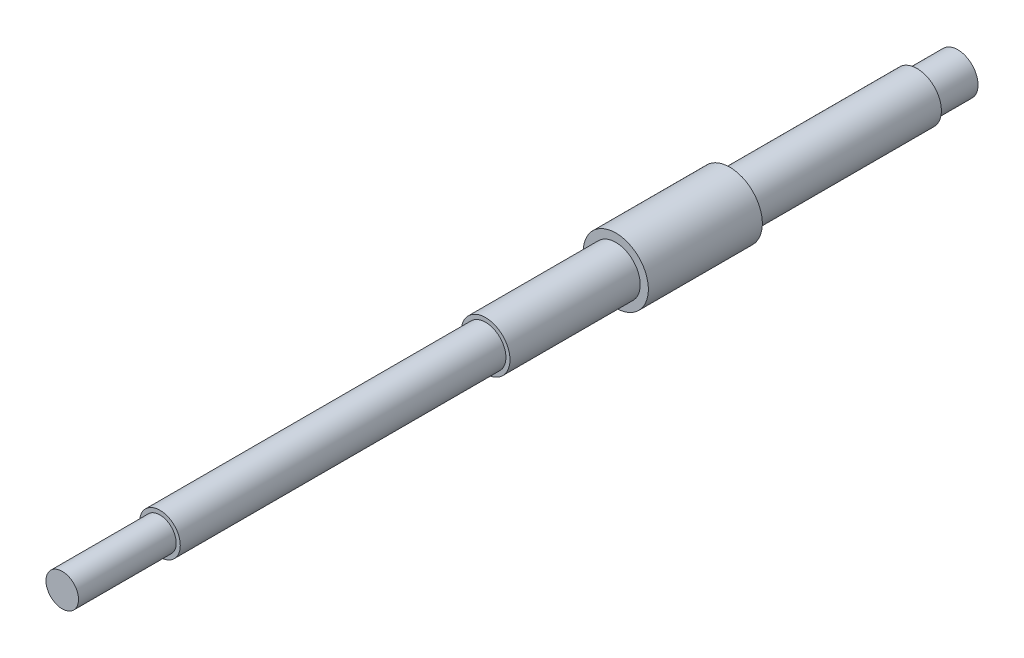
ISO-10303-21;
HEADER;
FILE_DESCRIPTION(('STEP AP214'),'2;1');
FILE_NAME('part.step','',(''),(''),'','','');
FILE_SCHEMA(('AUTOMOTIVE_DESIGN { 1 0 10303 214 1 1 1 1 }'));
ENDSEC;
DATA;
#1=APPLICATION_CONTEXT('core data for automotive mechanical design processes');
#2=APPLICATION_PROTOCOL_DEFINITION('international standard','automotive_design',2000,#1);
#3=PRODUCT_CONTEXT('',#1,'mechanical');
#4=PRODUCT('Part','Part','',(#3));
#5=PRODUCT_RELATED_PRODUCT_CATEGORY('part','',(#4));
#6=PRODUCT_DEFINITION_FORMATION('','',#4);
#7=PRODUCT_DEFINITION_CONTEXT('part definition',#1,'design');
#8=PRODUCT_DEFINITION('design','',#6,#7);
#9=PRODUCT_DEFINITION_SHAPE('','',#8);
#10=(LENGTH_UNIT() NAMED_UNIT(*) SI_UNIT(.MILLI.,.METRE.));
#11=(NAMED_UNIT(*) PLANE_ANGLE_UNIT() SI_UNIT($,.RADIAN.));
#12=(NAMED_UNIT(*) SI_UNIT($,.STERADIAN.) SOLID_ANGLE_UNIT());
#13=UNCERTAINTY_MEASURE_WITH_UNIT(LENGTH_MEASURE(1.E-05),#10,'distance_accuracy_value','');
#14=(GEOMETRIC_REPRESENTATION_CONTEXT(3) GLOBAL_UNCERTAINTY_ASSIGNED_CONTEXT((#13)) GLOBAL_UNIT_ASSIGNED_CONTEXT((#10,
#11,#12)) REPRESENTATION_CONTEXT('',''));
#15=CARTESIAN_POINT('',(0.,0.,0.));
#16=DIRECTION('',(0.,0.,1.));
#17=DIRECTION('',(1.,0.,0.));
#18=AXIS2_PLACEMENT_3D('',#15,#16,#17);
#19=CARTESIAN_POINT('',(0.,0.,16.));
#20=DIRECTION('',(0.,0.,-1.));
#21=DIRECTION('',(-1.,0.,0.));
#22=AXIS2_PLACEMENT_3D('',#19,#20,#21);
#23=CYLINDRICAL_SURFACE('',#22,3.);
#24=CARTESIAN_POINT('',(0.,0.,16.));
#25=DIRECTION('',(0.,0.,1.));
#26=DIRECTION('',(1.,0.,0.));
#27=AXIS2_PLACEMENT_3D('',#24,#25,#26);
#28=CIRCLE('',#27,3.);
#29=CARTESIAN_POINT('',(3.,0.,16.));
#30=VERTEX_POINT('',#29);
#31=EDGE_CURVE('E68',#30,#30,#28,.T.);
#32=ORIENTED_EDGE('',*,*,#31,.F.);
#33=EDGE_LOOP('',(#32));
#34=FACE_BOUND('',#33,.T.);
#35=CARTESIAN_POINT('',(0.,0.,0.));
#36=DIRECTION('',(0.,0.,1.));
#37=DIRECTION('',(1.,0.,0.));
#38=AXIS2_PLACEMENT_3D('',#35,#36,#37);
#39=CIRCLE('',#38,3.);
#40=CARTESIAN_POINT('',(3.,0.,0.));
#41=VERTEX_POINT('',#40);
#42=EDGE_CURVE('E39',#41,#41,#39,.T.);
#43=ORIENTED_EDGE('',*,*,#42,.T.);
#44=EDGE_LOOP('',(#43));
#45=FACE_BOUND('',#44,.T.);
#46=ADVANCED_FACE('F36',(#34,#45),#23,.T.);
#47=CARTESIAN_POINT('',(0.,0.,16.));
#48=DIRECTION('',(0.,0.,1.));
#49=DIRECTION('',(1.,0.,0.));
#50=AXIS2_PLACEMENT_3D('',#47,#48,#49);
#51=PLANE('',#50);
#52=CARTESIAN_POINT('',(0.,0.,16.));
#53=DIRECTION('',(0.,0.,1.));
#54=DIRECTION('',(1.,0.,0.));
#55=AXIS2_PLACEMENT_3D('',#52,#53,#54);
#56=CIRCLE('',#55,2.5);
#57=CARTESIAN_POINT('',(2.5,0.,16.));
#58=VERTEX_POINT('',#57);
#59=EDGE_CURVE('E48',#58,#58,#56,.T.);
#60=ORIENTED_EDGE('',*,*,#59,.F.);
#61=EDGE_LOOP('',(#60));
#62=FACE_BOUND('',#61,.T.);
#63=ORIENTED_EDGE('',*,*,#31,.T.);
#64=EDGE_LOOP('',(#63));
#65=FACE_BOUND('',#64,.T.);
#66=ADVANCED_FACE('F90',(#62,#65),#51,.T.);
#67=CARTESIAN_POINT('',(0.,0.,-14.));
#68=DIRECTION('',(0.,0.,1.));
#69=DIRECTION('',(1.,0.,0.));
#70=AXIS2_PLACEMENT_3D('',#67,#68,#69);
#71=CYLINDRICAL_SURFACE('',#70,4.);
#72=CARTESIAN_POINT('',(0.,0.,-14.));
#73=DIRECTION('',(0.,0.,-1.));
#74=DIRECTION('',(-1.,0.,0.));
#75=AXIS2_PLACEMENT_3D('',#72,#73,#74);
#76=CIRCLE('',#75,4.);
#77=CARTESIAN_POINT('',(-4.,0.,-14.));
#78=VERTEX_POINT('',#77);
#79=EDGE_CURVE('E69',#78,#78,#76,.T.);
#80=ORIENTED_EDGE('',*,*,#79,.F.);
#81=EDGE_LOOP('',(#80));
#82=FACE_BOUND('',#81,.T.);
#83=CARTESIAN_POINT('',(0.,0.,0.));
#84=DIRECTION('',(0.,0.,-1.));
#85=DIRECTION('',(-1.,0.,0.));
#86=AXIS2_PLACEMENT_3D('',#83,#84,#85);
#87=CIRCLE('',#86,4.);
#88=CARTESIAN_POINT('',(-4.,0.,0.));
#89=VERTEX_POINT('',#88);
#90=EDGE_CURVE('E65',#89,#89,#87,.T.);
#91=ORIENTED_EDGE('',*,*,#90,.T.);
#92=EDGE_LOOP('',(#91));
#93=FACE_BOUND('',#92,.T.);
#94=ADVANCED_FACE('F88',(#82,#93),#71,.T.);
#95=CARTESIAN_POINT('',(0.,0.,-14.));
#96=DIRECTION('',(0.,0.,-1.));
#97=DIRECTION('',(-1.,0.,0.));
#98=AXIS2_PLACEMENT_3D('',#95,#96,#97);
#99=PLANE('',#98);
#100=CARTESIAN_POINT('',(0.,0.,-14.));
#101=DIRECTION('',(0.,0.,-1.));
#102=DIRECTION('',(-1.,0.,0.));
#103=AXIS2_PLACEMENT_3D('',#100,#101,#102);
#104=CIRCLE('',#103,3.);
#105=CARTESIAN_POINT('',(-3.,0.,-14.));
#106=VERTEX_POINT('',#105);
#107=EDGE_CURVE('E62',#106,#106,#104,.T.);
#108=ORIENTED_EDGE('',*,*,#107,.F.);
#109=EDGE_LOOP('',(#108));
#110=FACE_BOUND('',#109,.T.);
#111=ORIENTED_EDGE('',*,*,#79,.T.);
#112=EDGE_LOOP('',(#111));
#113=FACE_BOUND('',#112,.T.);
#114=ADVANCED_FACE('F84',(#110,#113),#99,.T.);
#115=CARTESIAN_POINT('',(0.,0.,0.));
#116=DIRECTION('',(0.,0.,-1.));
#117=DIRECTION('',(-1.,0.,0.));
#118=AXIS2_PLACEMENT_3D('',#115,#116,#117);
#119=PLANE('',#118);
#120=ORIENTED_EDGE('',*,*,#42,.F.);
#121=EDGE_LOOP('',(#120));
#122=FACE_BOUND('',#121,.T.);
#123=ORIENTED_EDGE('',*,*,#90,.F.);
#124=EDGE_LOOP('',(#123));
#125=FACE_BOUND('',#124,.T.);
#126=ADVANCED_FACE('F80',(#122,#125),#119,.F.);
#127=CARTESIAN_POINT('',(0.,0.,-37.));
#128=DIRECTION('',(0.,0.,1.));
#129=DIRECTION('',(1.,0.,0.));
#130=AXIS2_PLACEMENT_3D('',#127,#128,#129);
#131=CYLINDRICAL_SURFACE('',#130,3.);
#132=CARTESIAN_POINT('',(0.,0.,-37.));
#133=DIRECTION('',(0.,0.,-1.));
#134=DIRECTION('',(-1.,0.,0.));
#135=AXIS2_PLACEMENT_3D('',#132,#133,#134);
#136=CIRCLE('',#135,3.);
#137=CARTESIAN_POINT('',(-3.,0.,-37.));
#138=VERTEX_POINT('',#137);
#139=EDGE_CURVE('E59',#138,#138,#136,.T.);
#140=ORIENTED_EDGE('',*,*,#139,.F.);
#141=EDGE_LOOP('',(#140));
#142=FACE_BOUND('',#141,.T.);
#143=ORIENTED_EDGE('',*,*,#107,.T.);
#144=EDGE_LOOP('',(#143));
#145=FACE_BOUND('',#144,.T.);
#146=ADVANCED_FACE('F83',(#142,#145),#131,.T.);
#147=CARTESIAN_POINT('',(0.,0.,-37.));
#148=DIRECTION('',(0.,0.,-1.));
#149=DIRECTION('',(-1.,0.,0.));
#150=AXIS2_PLACEMENT_3D('',#147,#148,#149);
#151=PLANE('',#150);
#152=CARTESIAN_POINT('',(0.,0.,-37.));
#153=DIRECTION('',(0.,0.,-1.));
#154=DIRECTION('',(-1.,0.,0.));
#155=AXIS2_PLACEMENT_3D('',#152,#153,#154);
#156=CIRCLE('',#155,2.5);
#157=CARTESIAN_POINT('',(-2.5,0.,-37.));
#158=VERTEX_POINT('',#157);
#159=EDGE_CURVE('E10',#158,#158,#156,.T.);
#160=ORIENTED_EDGE('',*,*,#159,.F.);
#161=EDGE_LOOP('',(#160));
#162=FACE_BOUND('',#161,.T.);
#163=ORIENTED_EDGE('',*,*,#139,.T.);
#164=EDGE_LOOP('',(#163));
#165=FACE_BOUND('',#164,.T.);
#166=ADVANCED_FACE('F127',(#162,#165),#151,.T.);
#167=CARTESIAN_POINT('',(0.,0.,56.));
#168=DIRECTION('',(0.,0.,-1.));
#169=DIRECTION('',(-1.,0.,0.));
#170=AXIS2_PLACEMENT_3D('',#167,#168,#169);
#171=CYLINDRICAL_SURFACE('',#170,2.5);
#172=CARTESIAN_POINT('',(0.,0.,56.));
#173=DIRECTION('',(0.,0.,1.));
#174=DIRECTION('',(1.,0.,0.));
#175=AXIS2_PLACEMENT_3D('',#172,#173,#174);
#176=CIRCLE('',#175,2.5);
#177=CARTESIAN_POINT('',(2.5,0.,56.));
#178=VERTEX_POINT('',#177);
#179=EDGE_CURVE('E55',#178,#178,#176,.T.);
#180=ORIENTED_EDGE('',*,*,#179,.F.);
#181=EDGE_LOOP('',(#180));
#182=FACE_BOUND('',#181,.T.);
#183=ORIENTED_EDGE('',*,*,#59,.T.);
#184=EDGE_LOOP('',(#183));
#185=FACE_BOUND('',#184,.T.);
#186=ADVANCED_FACE('F121',(#182,#185),#171,.T.);
#187=CARTESIAN_POINT('',(0.,0.,56.));
#188=DIRECTION('',(0.,0.,1.));
#189=DIRECTION('',(1.,0.,0.));
#190=AXIS2_PLACEMENT_3D('',#187,#188,#189);
#191=PLANE('',#190);
#192=CARTESIAN_POINT('',(0.,0.,56.));
#193=DIRECTION('',(0.,0.,1.));
#194=DIRECTION('',(1.,0.,0.));
#195=AXIS2_PLACEMENT_3D('',#192,#193,#194);
#196=CIRCLE('',#195,2.);
#197=CARTESIAN_POINT('',(2.,0.,56.));
#198=VERTEX_POINT('',#197);
#199=EDGE_CURVE('E43',#198,#198,#196,.T.);
#200=ORIENTED_EDGE('',*,*,#199,.F.);
#201=EDGE_LOOP('',(#200));
#202=FACE_BOUND('',#201,.T.);
#203=ORIENTED_EDGE('',*,*,#179,.T.);
#204=EDGE_LOOP('',(#203));
#205=FACE_BOUND('',#204,.T.);
#206=ADVANCED_FACE('F126',(#202,#205),#191,.T.);
#207=CARTESIAN_POINT('',(0.,0.,68.));
#208=DIRECTION('',(0.,0.,-1.));
#209=DIRECTION('',(-1.,0.,0.));
#210=AXIS2_PLACEMENT_3D('',#207,#208,#209);
#211=CYLINDRICAL_SURFACE('',#210,2.);
#212=CARTESIAN_POINT('',(0.,0.,68.));
#213=DIRECTION('',(0.,0.,1.));
#214=DIRECTION('',(1.,0.,0.));
#215=AXIS2_PLACEMENT_3D('',#212,#213,#214);
#216=CIRCLE('',#215,2.);
#217=CARTESIAN_POINT('',(2.,0.,68.));
#218=VERTEX_POINT('',#217);
#219=EDGE_CURVE('E53',#218,#218,#216,.T.);
#220=ORIENTED_EDGE('',*,*,#219,.F.);
#221=EDGE_LOOP('',(#220));
#222=FACE_BOUND('',#221,.T.);
#223=ORIENTED_EDGE('',*,*,#199,.T.);
#224=EDGE_LOOP('',(#223));
#225=FACE_BOUND('',#224,.T.);
#226=ADVANCED_FACE('F140',(#222,#225),#211,.T.);
#227=CARTESIAN_POINT('',(0.,0.,68.));
#228=DIRECTION('',(0.,0.,1.));
#229=DIRECTION('',(1.,0.,0.));
#230=AXIS2_PLACEMENT_3D('',#227,#228,#229);
#231=PLANE('',#230);
#232=ORIENTED_EDGE('',*,*,#219,.T.);
#233=EDGE_LOOP('',(#232));
#234=FACE_BOUND('',#233,.T.);
#235=ADVANCED_FACE('F151',(#234),#231,.T.);
#236=CARTESIAN_POINT('',(0.,0.,-42.));
#237=DIRECTION('',(0.,0.,1.));
#238=DIRECTION('',(1.,0.,0.));
#239=AXIS2_PLACEMENT_3D('',#236,#237,#238);
#240=CYLINDRICAL_SURFACE('',#239,2.5);
#241=CARTESIAN_POINT('',(0.,0.,-42.));
#242=DIRECTION('',(0.,0.,-1.));
#243=DIRECTION('',(-1.,0.,0.));
#244=AXIS2_PLACEMENT_3D('',#241,#242,#243);
#245=CIRCLE('',#244,2.5);
#246=CARTESIAN_POINT('',(-2.5,0.,-42.));
#247=VERTEX_POINT('',#246);
#248=EDGE_CURVE('E52',#247,#247,#245,.T.);
#249=ORIENTED_EDGE('',*,*,#248,.F.);
#250=EDGE_LOOP('',(#249));
#251=FACE_BOUND('',#250,.T.);
#252=ORIENTED_EDGE('',*,*,#159,.T.);
#253=EDGE_LOOP('',(#252));
#254=FACE_BOUND('',#253,.T.);
#255=ADVANCED_FACE('F162',(#251,#254),#240,.T.);
#256=CARTESIAN_POINT('',(0.,0.,-42.));
#257=DIRECTION('',(0.,0.,-1.));
#258=DIRECTION('',(-1.,0.,0.));
#259=AXIS2_PLACEMENT_3D('',#256,#257,#258);
#260=PLANE('',#259);
#261=ORIENTED_EDGE('',*,*,#248,.T.);
#262=EDGE_LOOP('',(#261));
#263=FACE_BOUND('',#262,.T.);
#264=ADVANCED_FACE('F181',(#263),#260,.T.);
#265=CLOSED_SHELL('',(#46,#66,#94,#114,#126,#146,#166,#186,#206,#226,#235,#255,#264));
#266=MANIFOLD_SOLID_BREP('B2',#265);
#267=ADVANCED_BREP_SHAPE_REPRESENTATION('',(#18,#266),#14);
#268=SHAPE_DEFINITION_REPRESENTATION(#9,#267);
ENDSEC;
END-ISO-10303-21;
